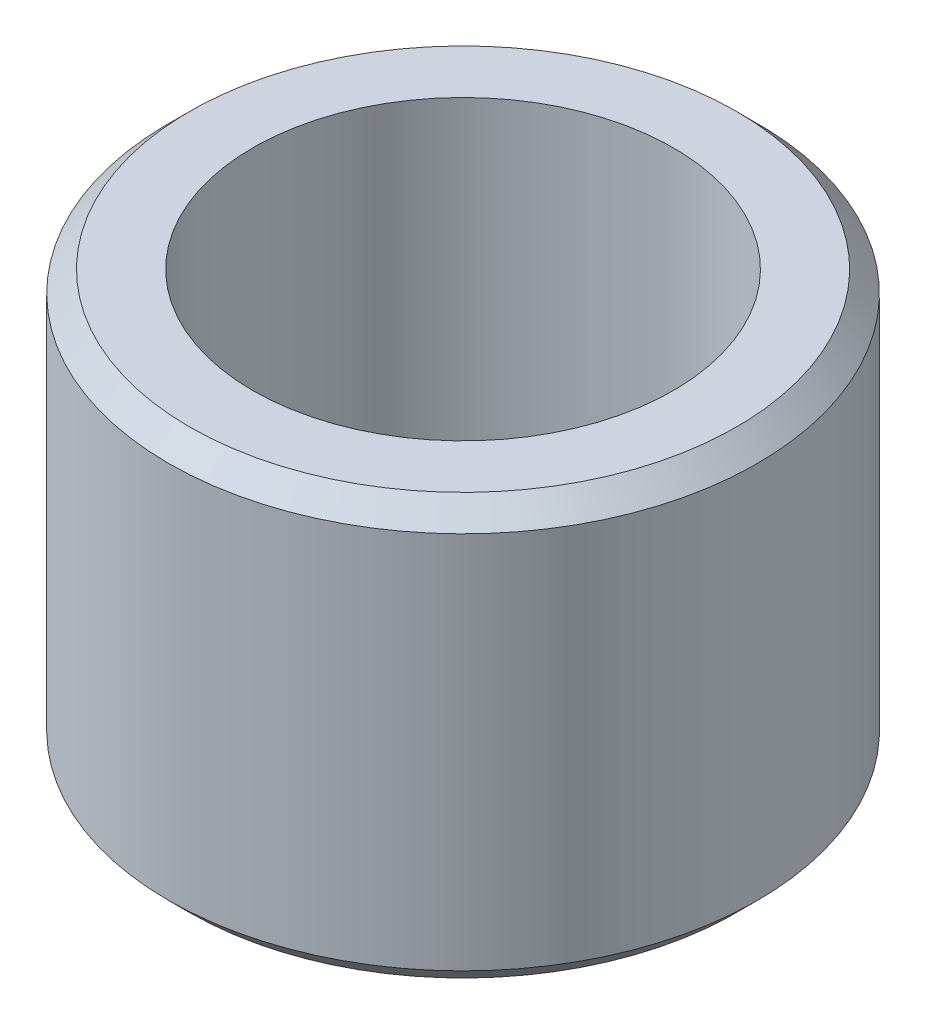
ISO-10303-21;
HEADER;
FILE_DESCRIPTION(('STEP AP214'),'2;1');
FILE_NAME('part.step','',(''),(''),'','','');
FILE_SCHEMA(('AUTOMOTIVE_DESIGN { 1 0 10303 214 1 1 1 1 }'));
ENDSEC;
DATA;
#1=APPLICATION_CONTEXT('core data for automotive mechanical design processes');
#2=APPLICATION_PROTOCOL_DEFINITION('international standard','automotive_design',2000,#1);
#3=PRODUCT_CONTEXT('',#1,'mechanical');
#4=PRODUCT('Part','Part','',(#3));
#5=PRODUCT_RELATED_PRODUCT_CATEGORY('part','',(#4));
#6=PRODUCT_DEFINITION_FORMATION('','',#4);
#7=PRODUCT_DEFINITION_CONTEXT('part definition',#1,'design');
#8=PRODUCT_DEFINITION('design','',#6,#7);
#9=PRODUCT_DEFINITION_SHAPE('','',#8);
#10=(LENGTH_UNIT() NAMED_UNIT(*) SI_UNIT(.MILLI.,.METRE.));
#11=(NAMED_UNIT(*) PLANE_ANGLE_UNIT() SI_UNIT($,.RADIAN.));
#12=(NAMED_UNIT(*) SI_UNIT($,.STERADIAN.) SOLID_ANGLE_UNIT());
#13=UNCERTAINTY_MEASURE_WITH_UNIT(LENGTH_MEASURE(1.E-05),#10,'distance_accuracy_value','');
#14=(GEOMETRIC_REPRESENTATION_CONTEXT(3) GLOBAL_UNCERTAINTY_ASSIGNED_CONTEXT((#13)) GLOBAL_UNIT_ASSIGNED_CONTEXT((#10,
#11,#12)) REPRESENTATION_CONTEXT('',''));
#15=CARTESIAN_POINT('',(0.,0.,0.));
#16=DIRECTION('',(0.,0.,1.));
#17=DIRECTION('',(1.,0.,0.));
#18=AXIS2_PLACEMENT_3D('',#15,#16,#17);
#19=CARTESIAN_POINT('',(0.,5.,0.));
#20=DIRECTION('',(0.,1.,0.));
#21=DIRECTION('',(0.,0.,1.));
#22=AXIS2_PLACEMENT_3D('',#19,#20,#21);
#23=PLANE('',#22);
#24=CARTESIAN_POINT('',(0.,5.,0.));
#25=DIRECTION('',(0.,1.,0.));
#26=DIRECTION('',(0.,0.,1.));
#27=AXIS2_PLACEMENT_3D('',#24,#25,#26);
#28=CIRCLE('',#27,6.5);
#29=CARTESIAN_POINT('',(0.,5.,6.5));
#30=VERTEX_POINT('',#29);
#31=EDGE_CURVE('E10',#30,#30,#28,.T.);
#32=ORIENTED_EDGE('',*,*,#31,.T.);
#33=EDGE_LOOP('',(#32));
#34=FACE_BOUND('',#33,.T.);
#35=CARTESIAN_POINT('',(0.,5.,0.));
#36=DIRECTION('',(0.,1.,0.));
#37=DIRECTION('',(0.,0.,1.));
#38=AXIS2_PLACEMENT_3D('',#35,#36,#37);
#39=CIRCLE('',#38,5.);
#40=CARTESIAN_POINT('',(0.,5.,5.));
#41=VERTEX_POINT('',#40);
#42=EDGE_CURVE('E67',#41,#41,#39,.T.);
#43=ORIENTED_EDGE('',*,*,#42,.F.);
#44=EDGE_LOOP('',(#43));
#45=FACE_BOUND('',#44,.T.);
#46=ADVANCED_FACE('F44',(#34,#45),#23,.T.);
#47=CARTESIAN_POINT('',(0.,-5.,0.));
#48=DIRECTION('',(0.,1.,0.));
#49=DIRECTION('',(0.,0.,1.));
#50=AXIS2_PLACEMENT_3D('',#47,#48,#49);
#51=PLANE('',#50);
#52=CARTESIAN_POINT('',(0.,-5.,0.));
#53=DIRECTION('',(0.,1.,0.));
#54=DIRECTION('',(0.,0.,1.));
#55=AXIS2_PLACEMENT_3D('',#52,#53,#54);
#56=CIRCLE('',#55,6.49999999999999);
#57=CARTESIAN_POINT('',(0.,-5.,6.49999999999999));
#58=VERTEX_POINT('',#57);
#59=EDGE_CURVE('E53',#58,#58,#56,.F.);
#60=ORIENTED_EDGE('',*,*,#59,.T.);
#61=EDGE_LOOP('',(#60));
#62=FACE_BOUND('',#61,.T.);
#63=CARTESIAN_POINT('',(0.,-5.,0.));
#64=DIRECTION('',(0.,1.,0.));
#65=DIRECTION('',(0.,0.,1.));
#66=AXIS2_PLACEMENT_3D('',#63,#64,#65);
#67=CIRCLE('',#66,5.);
#68=CARTESIAN_POINT('',(0.,-5.,5.));
#69=VERTEX_POINT('',#68);
#70=EDGE_CURVE('E72',#69,#69,#67,.T.);
#71=ORIENTED_EDGE('',*,*,#70,.T.);
#72=EDGE_LOOP('',(#71));
#73=FACE_BOUND('',#72,.T.);
#74=ADVANCED_FACE('F85',(#62,#73),#51,.F.);
#75=CARTESIAN_POINT('',(0.,5.,0.));
#76=DIRECTION('',(0.,-1.,0.));
#77=DIRECTION('',(0.,0.,-1.));
#78=AXIS2_PLACEMENT_3D('',#75,#76,#77);
#79=CYLINDRICAL_SURFACE('',#78,7.);
#80=CARTESIAN_POINT('',(0.,-4.5,0.));
#81=DIRECTION('',(0.,1.,0.));
#82=DIRECTION('',(0.,0.,1.));
#83=AXIS2_PLACEMENT_3D('',#80,#81,#82);
#84=CIRCLE('',#83,7.);
#85=CARTESIAN_POINT('',(0.,-4.5,7.));
#86=VERTEX_POINT('',#85);
#87=EDGE_CURVE('E56',#86,#86,#84,.T.);
#88=ORIENTED_EDGE('',*,*,#87,.T.);
#89=EDGE_LOOP('',(#88));
#90=FACE_BOUND('',#89,.T.);
#91=CARTESIAN_POINT('',(0.,4.5,0.));
#92=DIRECTION('',(0.,1.,0.));
#93=DIRECTION('',(0.,0.,1.));
#94=AXIS2_PLACEMENT_3D('',#91,#92,#93);
#95=CIRCLE('',#94,7.);
#96=CARTESIAN_POINT('',(0.,4.5,7.));
#97=VERTEX_POINT('',#96);
#98=EDGE_CURVE('E61',#97,#97,#95,.F.);
#99=ORIENTED_EDGE('',*,*,#98,.T.);
#100=EDGE_LOOP('',(#99));
#101=FACE_BOUND('',#100,.T.);
#102=ADVANCED_FACE('F90',(#90,#101),#79,.T.);
#103=CARTESIAN_POINT('',(0.,5.,0.));
#104=DIRECTION('',(0.,-1.,0.));
#105=DIRECTION('',(0.,0.,-1.));
#106=AXIS2_PLACEMENT_3D('',#103,#104,#105);
#107=CYLINDRICAL_SURFACE('',#106,5.);
#108=ORIENTED_EDGE('',*,*,#42,.T.);
#109=EDGE_LOOP('',(#108));
#110=FACE_BOUND('',#109,.T.);
#111=ORIENTED_EDGE('',*,*,#70,.F.);
#112=EDGE_LOOP('',(#111));
#113=FACE_BOUND('',#112,.T.);
#114=ADVANCED_FACE('F76',(#110,#113),#107,.F.);
#115=CARTESIAN_POINT('',(0.,-4.5,0.));
#116=DIRECTION('',(0.,1.,0.));
#117=DIRECTION('',(0.,0.,1.));
#118=AXIS2_PLACEMENT_3D('',#115,#116,#117);
#119=CONICAL_SURFACE('',#118,7.,0.785398163397451);
#120=ORIENTED_EDGE('',*,*,#59,.F.);
#121=EDGE_LOOP('',(#120));
#122=FACE_BOUND('',#121,.T.);
#123=ORIENTED_EDGE('',*,*,#87,.F.);
#124=EDGE_LOOP('',(#123));
#125=FACE_BOUND('',#124,.T.);
#126=ADVANCED_FACE('F96',(#122,#125),#119,.T.);
#127=CARTESIAN_POINT('',(0.,5.,0.));
#128=DIRECTION('',(0.,-1.,0.));
#129=DIRECTION('',(0.,0.,-1.));
#130=AXIS2_PLACEMENT_3D('',#127,#128,#129);
#131=CONICAL_SURFACE('',#130,6.5,0.785398163397447);
#132=ORIENTED_EDGE('',*,*,#98,.F.);
#133=EDGE_LOOP('',(#132));
#134=FACE_BOUND('',#133,.T.);
#135=ORIENTED_EDGE('',*,*,#31,.F.);
#136=EDGE_LOOP('',(#135));
#137=FACE_BOUND('',#136,.T.);
#138=ADVANCED_FACE('F48',(#134,#137),#131,.T.);
#139=CLOSED_SHELL('',(#46,#74,#102,#114,#126,#138));
#140=MANIFOLD_SOLID_BREP('B2',#139);
#141=ADVANCED_BREP_SHAPE_REPRESENTATION('',(#18,#140),#14);
#142=SHAPE_DEFINITION_REPRESENTATION(#9,#141);
ENDSEC;
END-ISO-10303-21;
